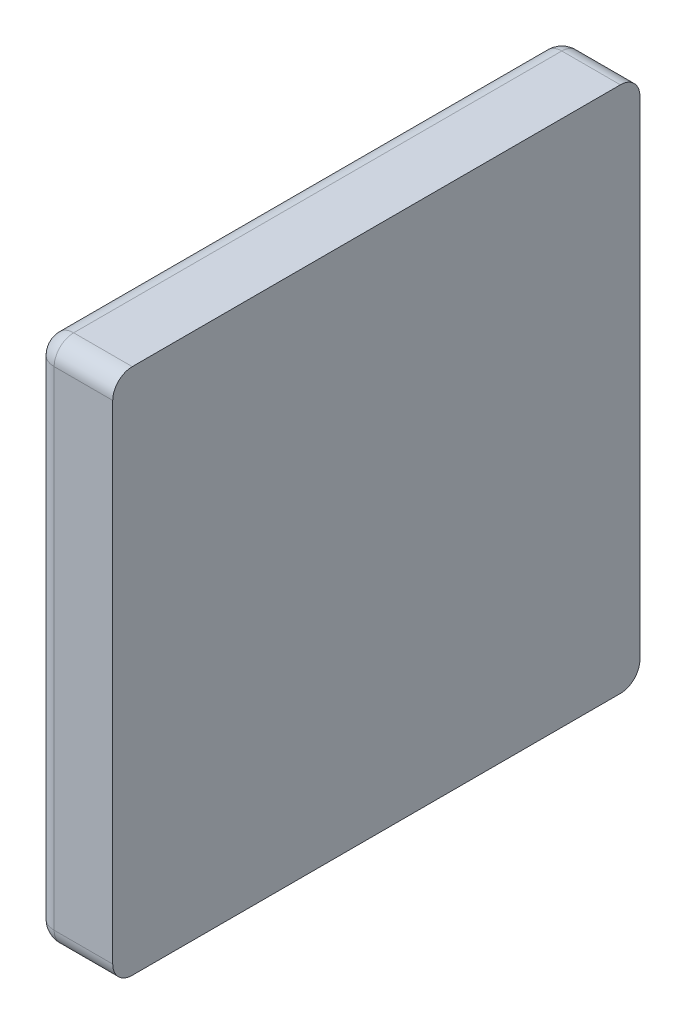
ISO-10303-21;
HEADER;
FILE_DESCRIPTION(('STEP AP214'),'2;1');
FILE_NAME('part.step','',(''),(''),'','','');
FILE_SCHEMA(('AUTOMOTIVE_DESIGN { 1 0 10303 214 1 1 1 1 }'));
ENDSEC;
DATA;
#1=APPLICATION_CONTEXT('core data for automotive mechanical design processes');
#2=APPLICATION_PROTOCOL_DEFINITION('international standard','automotive_design',2000,#1);
#3=PRODUCT_CONTEXT('',#1,'mechanical');
#4=PRODUCT('Part','Part','',(#3));
#5=PRODUCT_RELATED_PRODUCT_CATEGORY('part','',(#4));
#6=PRODUCT_DEFINITION_FORMATION('','',#4);
#7=PRODUCT_DEFINITION_CONTEXT('part definition',#1,'design');
#8=PRODUCT_DEFINITION('design','',#6,#7);
#9=PRODUCT_DEFINITION_SHAPE('','',#8);
#10=(LENGTH_UNIT() NAMED_UNIT(*) SI_UNIT(.MILLI.,.METRE.));
#11=(NAMED_UNIT(*) PLANE_ANGLE_UNIT() SI_UNIT($,.RADIAN.));
#12=(NAMED_UNIT(*) SI_UNIT($,.STERADIAN.) SOLID_ANGLE_UNIT());
#13=UNCERTAINTY_MEASURE_WITH_UNIT(LENGTH_MEASURE(1.E-05),#10,'distance_accuracy_value','');
#14=(GEOMETRIC_REPRESENTATION_CONTEXT(3) GLOBAL_UNCERTAINTY_ASSIGNED_CONTEXT((#13)) GLOBAL_UNIT_ASSIGNED_CONTEXT((#10,
#11,#12)) REPRESENTATION_CONTEXT('',''));
#15=CARTESIAN_POINT('',(0.,0.,0.));
#16=DIRECTION('',(0.,0.,1.));
#17=DIRECTION('',(1.,0.,0.));
#18=AXIS2_PLACEMENT_3D('',#15,#16,#17);
#19=CARTESIAN_POINT('',(0.,0.,0.));
#20=DIRECTION('',(1.,0.,0.));
#21=DIRECTION('',(0.,1.,0.));
#22=AXIS2_PLACEMENT_3D('',#19,#20,#21);
#23=PLANE('',#22);
#24=DIRECTION('',(0.,1.,0.));
#25=VECTOR('',#24,1.);
#26=CARTESIAN_POINT('',(0.,0.,1.3));
#27=LINE('',#26,#25);
#28=CARTESIAN_POINT('',(0.,0.05,1.3));
#29=VERTEX_POINT('',#28);
#30=CARTESIAN_POINT('',(0.,1.3,1.3));
#31=VERTEX_POINT('',#30);
#32=EDGE_CURVE('E11',#29,#31,#27,.T.);
#33=ORIENTED_EDGE('',*,*,#32,.T.);
#34=DIRECTION('',(0.,0.,1.));
#35=VECTOR('',#34,1.);
#36=CARTESIAN_POINT('',(0.,1.3,0.));
#37=LINE('',#36,#35);
#38=CARTESIAN_POINT('',(0.,1.3,0.05));
#39=VERTEX_POINT('',#38);
#40=EDGE_CURVE('E146',#39,#31,#37,.T.);
#41=ORIENTED_EDGE('',*,*,#40,.F.);
#42=DIRECTION('',(0.,1.,0.));
#43=VECTOR('',#42,1.);
#44=CARTESIAN_POINT('',(0.,0.,0.05));
#45=LINE('',#44,#43);
#46=CARTESIAN_POINT('',(0.,0.05,0.05));
#47=VERTEX_POINT('',#46);
#48=EDGE_CURVE('E207',#47,#39,#45,.T.);
#49=ORIENTED_EDGE('',*,*,#48,.F.);
#50=DIRECTION('',(0.,0.,1.));
#51=VECTOR('',#50,1.);
#52=CARTESIAN_POINT('',(0.,0.05,0.));
#53=LINE('',#52,#51);
#54=EDGE_CURVE('E27',#47,#29,#53,.T.);
#55=ORIENTED_EDGE('',*,*,#54,.T.);
#56=EDGE_LOOP('',(#33,#41,#49,#55));
#57=FACE_BOUND('',#56,.T.);
#58=ADVANCED_FACE('F17',(#57),#23,.F.);
#59=CARTESIAN_POINT('',(0.05,0.05,0.));
#60=DIRECTION('',(0.,0.,1.));
#61=DIRECTION('',(-1.,0.,0.));
#62=AXIS2_PLACEMENT_3D('',#59,#60,#61);
#63=CYLINDRICAL_SURFACE('',#62,0.05);
#64=ORIENTED_EDGE('',*,*,#54,.F.);
#65=CARTESIAN_POINT('',(0.05,0.05,0.05));
#66=DIRECTION('',(0.,0.,1.));
#67=DIRECTION('',(-1.,0.,0.));
#68=AXIS2_PLACEMENT_3D('',#65,#66,#67);
#69=CIRCLE('',#68,0.05);
#70=CARTESIAN_POINT('',(0.05,0.,0.05));
#71=VERTEX_POINT('',#70);
#72=EDGE_CURVE('E152',#47,#71,#69,.T.);
#73=ORIENTED_EDGE('',*,*,#72,.T.);
#74=DIRECTION('',(0.,0.,1.));
#75=VECTOR('',#74,1.);
#76=CARTESIAN_POINT('',(0.05,0.,0.));
#77=LINE('',#76,#75);
#78=CARTESIAN_POINT('',(0.05,0.,1.3));
#79=VERTEX_POINT('',#78);
#80=EDGE_CURVE('E156',#71,#79,#77,.T.);
#81=ORIENTED_EDGE('',*,*,#80,.T.);
#82=CARTESIAN_POINT('',(0.05,0.05,1.3));
#83=DIRECTION('',(0.,0.,1.));
#84=DIRECTION('',(-1.,0.,0.));
#85=AXIS2_PLACEMENT_3D('',#82,#83,#84);
#86=CIRCLE('',#85,0.05);
#87=EDGE_CURVE('E160',#29,#79,#86,.T.);
#88=ORIENTED_EDGE('',*,*,#87,.F.);
#89=EDGE_LOOP('',(#64,#73,#81,#88));
#90=FACE_BOUND('',#89,.T.);
#91=ADVANCED_FACE('F257',(#90),#63,.T.);
#92=CARTESIAN_POINT('',(0.05,0.,0.05));
#93=DIRECTION('',(0.,1.,0.));
#94=DIRECTION('',(-1.,0.,0.));
#95=AXIS2_PLACEMENT_3D('',#92,#93,#94);
#96=CYLINDRICAL_SURFACE('',#95,0.05);
#97=ORIENTED_EDGE('',*,*,#48,.T.);
#98=CARTESIAN_POINT('',(0.05,1.3,0.05));
#99=DIRECTION('',(0.,1.,0.));
#100=DIRECTION('',(-1.,0.,0.));
#101=AXIS2_PLACEMENT_3D('',#98,#99,#100);
#102=CIRCLE('',#101,0.05);
#103=CARTESIAN_POINT('',(0.05,1.3,0.));
#104=VERTEX_POINT('',#103);
#105=EDGE_CURVE('E53',#104,#39,#102,.T.);
#106=ORIENTED_EDGE('',*,*,#105,.F.);
#107=DIRECTION('',(0.,1.,0.));
#108=VECTOR('',#107,1.);
#109=CARTESIAN_POINT('',(0.05,0.,0.));
#110=LINE('',#109,#108);
#111=CARTESIAN_POINT('',(0.05,0.05,0.));
#112=VERTEX_POINT('',#111);
#113=EDGE_CURVE('E120',#112,#104,#110,.T.);
#114=ORIENTED_EDGE('',*,*,#113,.F.);
#115=CARTESIAN_POINT('',(0.05,0.05,0.05));
#116=DIRECTION('',(0.,1.,0.));
#117=DIRECTION('',(-1.,0.,0.));
#118=AXIS2_PLACEMENT_3D('',#115,#116,#117);
#119=CIRCLE('',#118,0.05);
#120=EDGE_CURVE('E145',#112,#47,#119,.T.);
#121=ORIENTED_EDGE('',*,*,#120,.T.);
#122=EDGE_LOOP('',(#97,#106,#114,#121));
#123=FACE_BOUND('',#122,.T.);
#124=ADVANCED_FACE('F336',(#123),#96,.T.);
#125=CARTESIAN_POINT('',(0.05,0.,1.3));
#126=DIRECTION('',(0.,1.,0.));
#127=DIRECTION('',(-1.,0.,0.));
#128=AXIS2_PLACEMENT_3D('',#125,#126,#127);
#129=CYLINDRICAL_SURFACE('',#128,0.05);
#130=CARTESIAN_POINT('',(0.05,0.05,1.3));
#131=DIRECTION('',(0.,-1.,0.));
#132=DIRECTION('',(-1.,0.,0.));
#133=AXIS2_PLACEMENT_3D('',#130,#131,#132);
#134=CIRCLE('',#133,0.05);
#135=CARTESIAN_POINT('',(0.05,0.05,1.35));
#136=VERTEX_POINT('',#135);
#137=EDGE_CURVE('E150',#136,#29,#134,.T.);
#138=ORIENTED_EDGE('',*,*,#137,.F.);
#139=DIRECTION('',(0.,1.,0.));
#140=VECTOR('',#139,1.);
#141=CARTESIAN_POINT('',(0.05,0.,1.35));
#142=LINE('',#141,#140);
#143=CARTESIAN_POINT('',(0.05,1.3,1.35));
#144=VERTEX_POINT('',#143);
#145=EDGE_CURVE('E143',#136,#144,#142,.T.);
#146=ORIENTED_EDGE('',*,*,#145,.T.);
#147=CARTESIAN_POINT('',(0.05,1.3,1.3));
#148=DIRECTION('',(0.,1.,0.));
#149=DIRECTION('',(-1.,0.,0.));
#150=AXIS2_PLACEMENT_3D('',#147,#148,#149);
#151=CIRCLE('',#150,0.05);
#152=EDGE_CURVE('E40',#31,#144,#151,.T.);
#153=ORIENTED_EDGE('',*,*,#152,.F.);
#154=ORIENTED_EDGE('',*,*,#32,.F.);
#155=EDGE_LOOP('',(#138,#146,#153,#154));
#156=FACE_BOUND('',#155,.T.);
#157=ADVANCED_FACE('F297',(#156),#129,.T.);
#158=CARTESIAN_POINT('',(0.05,1.3,0.));
#159=DIRECTION('',(0.,0.,1.));
#160=DIRECTION('',(-1.,0.,0.));
#161=AXIS2_PLACEMENT_3D('',#158,#159,#160);
#162=CYLINDRICAL_SURFACE('',#161,0.05);
#163=CARTESIAN_POINT('',(0.05,1.3,1.3));
#164=DIRECTION('',(0.,0.,1.));
#165=DIRECTION('',(-1.,0.,0.));
#166=AXIS2_PLACEMENT_3D('',#163,#164,#165);
#167=CIRCLE('',#166,0.05);
#168=CARTESIAN_POINT('',(0.05,1.35,1.3));
#169=VERTEX_POINT('',#168);
#170=EDGE_CURVE('E183',#169,#31,#167,.T.);
#171=ORIENTED_EDGE('',*,*,#170,.F.);
#172=DIRECTION('',(0.,0.,1.));
#173=VECTOR('',#172,1.);
#174=CARTESIAN_POINT('',(0.05,1.35,0.));
#175=LINE('',#174,#173);
#176=CARTESIAN_POINT('',(0.05,1.35,0.05));
#177=VERTEX_POINT('',#176);
#178=EDGE_CURVE('E221',#177,#169,#175,.T.);
#179=ORIENTED_EDGE('',*,*,#178,.F.);
#180=CARTESIAN_POINT('',(0.05,1.3,0.05));
#181=DIRECTION('',(0.,0.,-1.));
#182=DIRECTION('',(-1.,0.,0.));
#183=AXIS2_PLACEMENT_3D('',#180,#181,#182);
#184=CIRCLE('',#183,0.05);
#185=EDGE_CURVE('E177',#39,#177,#184,.T.);
#186=ORIENTED_EDGE('',*,*,#185,.F.);
#187=ORIENTED_EDGE('',*,*,#40,.T.);
#188=EDGE_LOOP('',(#171,#179,#186,#187));
#189=FACE_BOUND('',#188,.T.);
#190=ADVANCED_FACE('F341',(#189),#162,.T.);
#191=CARTESIAN_POINT('',(0.05,0.05,0.05));
#192=DIRECTION('',(0.,0.,1.));
#193=DIRECTION('',(-1.,0.,0.));
#194=AXIS2_PLACEMENT_3D('',#191,#192,#193);
#195=SPHERICAL_SURFACE('',#194,0.05);
#196=ORIENTED_EDGE('',*,*,#120,.F.);
#197=CARTESIAN_POINT('',(0.05,0.05,0.05));
#198=DIRECTION('',(-1.,0.,0.));
#199=DIRECTION('',(0.,-1.,0.));
#200=AXIS2_PLACEMENT_3D('',#197,#198,#199);
#201=CIRCLE('',#200,0.05);
#202=EDGE_CURVE('E163',#112,#71,#201,.T.);
#203=ORIENTED_EDGE('',*,*,#202,.T.);
#204=ORIENTED_EDGE('',*,*,#72,.F.);
#205=EDGE_LOOP('',(#196,#203,#204));
#206=FACE_BOUND('',#205,.T.);
#207=ADVANCED_FACE('F247',(#206),#195,.T.);
#208=CARTESIAN_POINT('',(0.05,0.05,1.3));
#209=DIRECTION('',(0.,0.,-1.));
#210=DIRECTION('',(-1.,0.,0.));
#211=AXIS2_PLACEMENT_3D('',#208,#209,#210);
#212=SPHERICAL_SURFACE('',#211,0.05);
#213=ORIENTED_EDGE('',*,*,#87,.T.);
#214=CARTESIAN_POINT('',(0.05,0.05,1.3));
#215=DIRECTION('',(1.,0.,0.));
#216=DIRECTION('',(0.,-1.,0.));
#217=AXIS2_PLACEMENT_3D('',#214,#215,#216);
#218=CIRCLE('',#217,0.05);
#219=EDGE_CURVE('E167',#136,#79,#218,.T.);
#220=ORIENTED_EDGE('',*,*,#219,.F.);
#221=ORIENTED_EDGE('',*,*,#137,.T.);
#222=EDGE_LOOP('',(#213,#220,#221));
#223=FACE_BOUND('',#222,.T.);
#224=ADVANCED_FACE('F298',(#223),#212,.T.);
#225=CARTESIAN_POINT('',(0.,0.,0.));
#226=DIRECTION('',(0.,1.,0.));
#227=DIRECTION('',(1.,0.,0.));
#228=AXIS2_PLACEMENT_3D('',#225,#226,#227);
#229=PLANE('',#228);
#230=DIRECTION('',(0.,0.,1.));
#231=VECTOR('',#230,1.);
#232=CARTESIAN_POINT('',(0.2,0.,0.));
#233=LINE('',#232,#231);
#234=CARTESIAN_POINT('',(0.2,0.,0.05));
#235=VERTEX_POINT('',#234);
#236=CARTESIAN_POINT('',(0.2,0.,1.3));
#237=VERTEX_POINT('',#236);
#238=EDGE_CURVE('E147',#235,#237,#233,.T.);
#239=ORIENTED_EDGE('',*,*,#238,.T.);
#240=DIRECTION('',(1.,0.,0.));
#241=VECTOR('',#240,1.);
#242=CARTESIAN_POINT('',(0.,0.,1.3));
#243=LINE('',#242,#241);
#244=EDGE_CURVE('E170',#79,#237,#243,.T.);
#245=ORIENTED_EDGE('',*,*,#244,.F.);
#246=ORIENTED_EDGE('',*,*,#80,.F.);
#247=DIRECTION('',(1.,0.,0.));
#248=VECTOR('',#247,1.);
#249=CARTESIAN_POINT('',(0.,0.,0.05));
#250=LINE('',#249,#248);
#251=EDGE_CURVE('E124',#71,#235,#250,.T.);
#252=ORIENTED_EDGE('',*,*,#251,.T.);
#253=EDGE_LOOP('',(#239,#245,#246,#252));
#254=FACE_BOUND('',#253,.T.);
#255=ADVANCED_FACE('F254',(#254),#229,.F.);
#256=CARTESIAN_POINT('',(0.,0.,0.));
#257=DIRECTION('',(0.,0.,1.));
#258=DIRECTION('',(1.,0.,0.));
#259=AXIS2_PLACEMENT_3D('',#256,#257,#258);
#260=PLANE('',#259);
#261=DIRECTION('',(1.,0.,0.));
#262=VECTOR('',#261,1.);
#263=CARTESIAN_POINT('',(0.,1.3,0.));
#264=LINE('',#263,#262);
#265=CARTESIAN_POINT('',(0.2,1.3,0.));
#266=VERTEX_POINT('',#265);
#267=EDGE_CURVE('E21',#104,#266,#264,.T.);
#268=ORIENTED_EDGE('',*,*,#267,.T.);
#269=DIRECTION('',(0.,1.,0.));
#270=VECTOR('',#269,1.);
#271=CARTESIAN_POINT('',(0.2,0.,0.));
#272=LINE('',#271,#270);
#273=CARTESIAN_POINT('',(0.2,0.05,0.));
#274=VERTEX_POINT('',#273);
#275=EDGE_CURVE('E104',#274,#266,#272,.T.);
#276=ORIENTED_EDGE('',*,*,#275,.F.);
#277=DIRECTION('',(1.,0.,0.));
#278=VECTOR('',#277,1.);
#279=CARTESIAN_POINT('',(0.,0.05,0.));
#280=LINE('',#279,#278);
#281=EDGE_CURVE('E176',#112,#274,#280,.T.);
#282=ORIENTED_EDGE('',*,*,#281,.F.);
#283=ORIENTED_EDGE('',*,*,#113,.T.);
#284=EDGE_LOOP('',(#268,#276,#282,#283));
#285=FACE_BOUND('',#284,.T.);
#286=ADVANCED_FACE('F119',(#285),#260,.F.);
#287=CARTESIAN_POINT('',(0.05,1.3,0.05));
#288=DIRECTION('',(0.,0.,1.));
#289=DIRECTION('',(-1.,0.,0.));
#290=AXIS2_PLACEMENT_3D('',#287,#288,#289);
#291=SPHERICAL_SURFACE('',#290,0.05);
#292=ORIENTED_EDGE('',*,*,#185,.T.);
#293=CARTESIAN_POINT('',(0.05,1.3,0.05));
#294=DIRECTION('',(1.,0.,0.));
#295=DIRECTION('',(0.,1.,0.));
#296=AXIS2_PLACEMENT_3D('',#293,#294,#295);
#297=CIRCLE('',#296,0.05);
#298=EDGE_CURVE('E187',#104,#177,#297,.T.);
#299=ORIENTED_EDGE('',*,*,#298,.F.);
#300=ORIENTED_EDGE('',*,*,#105,.T.);
#301=EDGE_LOOP('',(#292,#299,#300));
#302=FACE_BOUND('',#301,.T.);
#303=ADVANCED_FACE('F357',(#302),#291,.T.);
#304=CARTESIAN_POINT('',(0.,0.,1.35));
#305=DIRECTION('',(0.,0.,1.));
#306=DIRECTION('',(1.,0.,0.));
#307=AXIS2_PLACEMENT_3D('',#304,#305,#306);
#308=PLANE('',#307);
#309=ORIENTED_EDGE('',*,*,#145,.F.);
#310=DIRECTION('',(1.,0.,0.));
#311=VECTOR('',#310,1.);
#312=CARTESIAN_POINT('',(0.,0.05,1.35));
#313=LINE('',#312,#311);
#314=CARTESIAN_POINT('',(0.2,0.05,1.35));
#315=VERTEX_POINT('',#314);
#316=EDGE_CURVE('E141',#136,#315,#313,.T.);
#317=ORIENTED_EDGE('',*,*,#316,.T.);
#318=DIRECTION('',(0.,1.,0.));
#319=VECTOR('',#318,1.);
#320=CARTESIAN_POINT('',(0.2,0.,1.35));
#321=LINE('',#320,#319);
#322=CARTESIAN_POINT('',(0.2,1.3,1.35));
#323=VERTEX_POINT('',#322);
#324=EDGE_CURVE('E182',#315,#323,#321,.T.);
#325=ORIENTED_EDGE('',*,*,#324,.T.);
#326=DIRECTION('',(1.,0.,0.));
#327=VECTOR('',#326,1.);
#328=CARTESIAN_POINT('',(0.,1.3,1.35));
#329=LINE('',#328,#327);
#330=EDGE_CURVE('E188',#144,#323,#329,.T.);
#331=ORIENTED_EDGE('',*,*,#330,.F.);
#332=EDGE_LOOP('',(#309,#317,#325,#331));
#333=FACE_BOUND('',#332,.T.);
#334=ADVANCED_FACE('F275',(#333),#308,.T.);
#335=CARTESIAN_POINT('',(0.05,1.3,1.3));
#336=DIRECTION('',(0.,-1.,0.));
#337=DIRECTION('',(-1.,0.,0.));
#338=AXIS2_PLACEMENT_3D('',#335,#336,#337);
#339=SPHERICAL_SURFACE('',#338,0.05);
#340=ORIENTED_EDGE('',*,*,#152,.T.);
#341=CARTESIAN_POINT('',(0.05,1.3,1.3));
#342=DIRECTION('',(1.,0.,0.));
#343=DIRECTION('',(0.,0.,1.));
#344=AXIS2_PLACEMENT_3D('',#341,#342,#343);
#345=CIRCLE('',#344,0.05);
#346=EDGE_CURVE('E184',#169,#144,#345,.T.);
#347=ORIENTED_EDGE('',*,*,#346,.F.);
#348=ORIENTED_EDGE('',*,*,#170,.T.);
#349=EDGE_LOOP('',(#340,#347,#348));
#350=FACE_BOUND('',#349,.T.);
#351=ADVANCED_FACE('F315',(#350),#339,.T.);
#352=CARTESIAN_POINT('',(0.,1.35,0.));
#353=DIRECTION('',(0.,1.,0.));
#354=DIRECTION('',(1.,0.,0.));
#355=AXIS2_PLACEMENT_3D('',#352,#353,#354);
#356=PLANE('',#355);
#357=DIRECTION('',(1.,0.,0.));
#358=VECTOR('',#357,1.);
#359=CARTESIAN_POINT('',(0.,1.35,0.05));
#360=LINE('',#359,#358);
#361=CARTESIAN_POINT('',(0.2,1.35,0.05));
#362=VERTEX_POINT('',#361);
#363=EDGE_CURVE('E128',#177,#362,#360,.T.);
#364=ORIENTED_EDGE('',*,*,#363,.F.);
#365=ORIENTED_EDGE('',*,*,#178,.T.);
#366=DIRECTION('',(1.,0.,0.));
#367=VECTOR('',#366,1.);
#368=CARTESIAN_POINT('',(0.,1.35,1.3));
#369=LINE('',#368,#367);
#370=CARTESIAN_POINT('',(0.2,1.35,1.3));
#371=VERTEX_POINT('',#370);
#372=EDGE_CURVE('E228',#169,#371,#369,.T.);
#373=ORIENTED_EDGE('',*,*,#372,.T.);
#374=DIRECTION('',(0.,0.,1.));
#375=VECTOR('',#374,1.);
#376=CARTESIAN_POINT('',(0.2,1.35,0.));
#377=LINE('',#376,#375);
#378=EDGE_CURVE('E131',#362,#371,#377,.T.);
#379=ORIENTED_EDGE('',*,*,#378,.F.);
#380=EDGE_LOOP('',(#364,#365,#373,#379));
#381=FACE_BOUND('',#380,.T.);
#382=ADVANCED_FACE('F311',(#381),#356,.T.);
#383=CARTESIAN_POINT('',(0.,0.05,0.05));
#384=DIRECTION('',(1.,0.,0.));
#385=DIRECTION('',(0.,-1.,0.));
#386=AXIS2_PLACEMENT_3D('',#383,#384,#385);
#387=CYLINDRICAL_SURFACE('',#386,0.05);
#388=ORIENTED_EDGE('',*,*,#202,.F.);
#389=ORIENTED_EDGE('',*,*,#281,.T.);
#390=CARTESIAN_POINT('',(0.2,0.05,0.05));
#391=DIRECTION('',(1.,0.,0.));
#392=DIRECTION('',(0.,-1.,0.));
#393=AXIS2_PLACEMENT_3D('',#390,#391,#392);
#394=CIRCLE('',#393,0.05);
#395=EDGE_CURVE('E111',#235,#274,#394,.T.);
#396=ORIENTED_EDGE('',*,*,#395,.F.);
#397=ORIENTED_EDGE('',*,*,#251,.F.);
#398=EDGE_LOOP('',(#388,#389,#396,#397));
#399=FACE_BOUND('',#398,.T.);
#400=ADVANCED_FACE('F259',(#399),#387,.T.);
#401=CARTESIAN_POINT('',(0.,0.05,1.3));
#402=DIRECTION('',(1.,0.,0.));
#403=DIRECTION('',(0.,-1.,0.));
#404=AXIS2_PLACEMENT_3D('',#401,#402,#403);
#405=CYLINDRICAL_SURFACE('',#404,0.05);
#406=ORIENTED_EDGE('',*,*,#244,.T.);
#407=CARTESIAN_POINT('',(0.2,0.05,1.3));
#408=DIRECTION('',(1.,0.,0.));
#409=DIRECTION('',(0.,-1.,0.));
#410=AXIS2_PLACEMENT_3D('',#407,#408,#409);
#411=CIRCLE('',#410,0.05);
#412=EDGE_CURVE('E194',#315,#237,#411,.T.);
#413=ORIENTED_EDGE('',*,*,#412,.F.);
#414=ORIENTED_EDGE('',*,*,#316,.F.);
#415=ORIENTED_EDGE('',*,*,#219,.T.);
#416=EDGE_LOOP('',(#406,#413,#414,#415));
#417=FACE_BOUND('',#416,.T.);
#418=ADVANCED_FACE('F19',(#417),#405,.T.);
#419=CARTESIAN_POINT('',(0.2,0.,0.));
#420=DIRECTION('',(1.,0.,0.));
#421=DIRECTION('',(0.,1.,0.));
#422=AXIS2_PLACEMENT_3D('',#419,#420,#421);
#423=PLANE('',#422);
#424=ORIENTED_EDGE('',*,*,#238,.F.);
#425=ORIENTED_EDGE('',*,*,#395,.T.);
#426=ORIENTED_EDGE('',*,*,#275,.T.);
#427=CARTESIAN_POINT('',(0.2,1.3,0.05));
#428=DIRECTION('',(1.,0.,0.));
#429=DIRECTION('',(0.,1.,0.));
#430=AXIS2_PLACEMENT_3D('',#427,#428,#429);
#431=CIRCLE('',#430,0.05);
#432=EDGE_CURVE('E109',#266,#362,#431,.T.);
#433=ORIENTED_EDGE('',*,*,#432,.T.);
#434=ORIENTED_EDGE('',*,*,#378,.T.);
#435=CARTESIAN_POINT('',(0.2,1.3,1.3));
#436=DIRECTION('',(1.,0.,0.));
#437=DIRECTION('',(0.,1.,0.));
#438=AXIS2_PLACEMENT_3D('',#435,#436,#437);
#439=CIRCLE('',#438,0.05);
#440=EDGE_CURVE('E137',#371,#323,#439,.T.);
#441=ORIENTED_EDGE('',*,*,#440,.T.);
#442=ORIENTED_EDGE('',*,*,#324,.F.);
#443=ORIENTED_EDGE('',*,*,#412,.T.);
#444=EDGE_LOOP('',(#424,#425,#426,#433,#434,#441,#442,#443));
#445=FACE_BOUND('',#444,.T.);
#446=ADVANCED_FACE('F107',(#445),#423,.T.);
#447=CARTESIAN_POINT('',(0.,1.3,0.05));
#448=DIRECTION('',(1.,0.,0.));
#449=DIRECTION('',(0.,1.,0.));
#450=AXIS2_PLACEMENT_3D('',#447,#448,#449);
#451=CYLINDRICAL_SURFACE('',#450,0.05);
#452=ORIENTED_EDGE('',*,*,#363,.T.);
#453=ORIENTED_EDGE('',*,*,#432,.F.);
#454=ORIENTED_EDGE('',*,*,#267,.F.);
#455=ORIENTED_EDGE('',*,*,#298,.T.);
#456=EDGE_LOOP('',(#452,#453,#454,#455));
#457=FACE_BOUND('',#456,.T.);
#458=ADVANCED_FACE('F126',(#457),#451,.T.);
#459=CARTESIAN_POINT('',(0.,1.3,1.3));
#460=DIRECTION('',(1.,0.,0.));
#461=DIRECTION('',(0.,1.,0.));
#462=AXIS2_PLACEMENT_3D('',#459,#460,#461);
#463=CYLINDRICAL_SURFACE('',#462,0.05);
#464=ORIENTED_EDGE('',*,*,#372,.F.);
#465=ORIENTED_EDGE('',*,*,#346,.T.);
#466=ORIENTED_EDGE('',*,*,#330,.T.);
#467=ORIENTED_EDGE('',*,*,#440,.F.);
#468=EDGE_LOOP('',(#464,#465,#466,#467));
#469=FACE_BOUND('',#468,.T.);
#470=ADVANCED_FACE('F272',(#469),#463,.T.);
#471=CLOSED_SHELL('',(#58,#91,#124,#157,#190,#207,#224,#255,#286,#303,#334,#351,#382,#400,#418,
#446,#458,#470));
#472=MANIFOLD_SOLID_BREP('B1',#471);
#473=ADVANCED_BREP_SHAPE_REPRESENTATION('',(#18,#472),#14);
#474=SHAPE_DEFINITION_REPRESENTATION(#9,#473);
ENDSEC;
END-ISO-10303-21;
